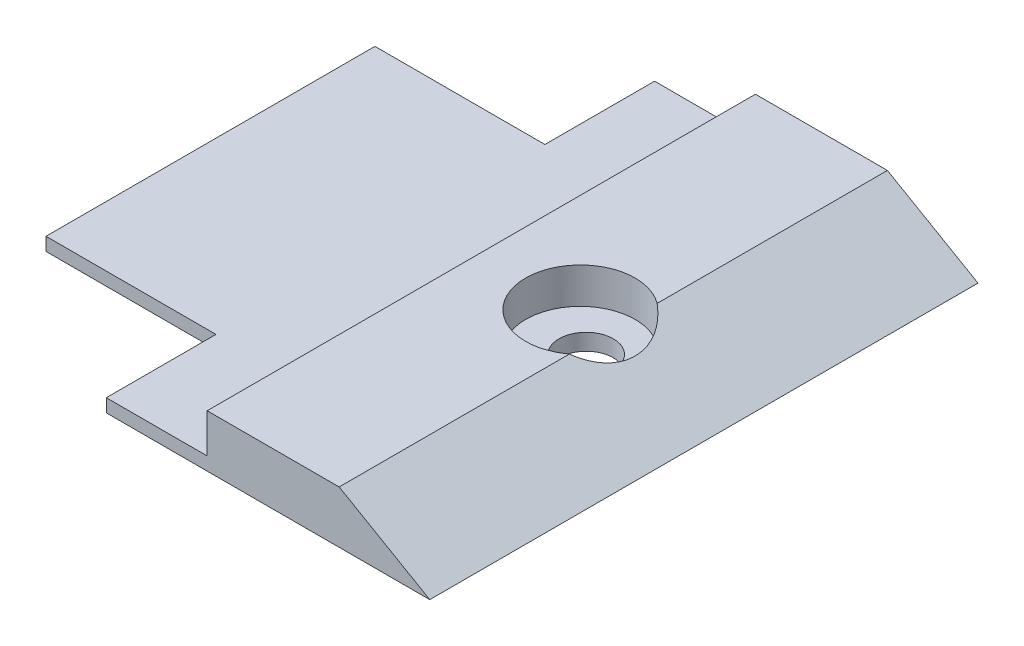
ISO-10303-21;
HEADER;
FILE_DESCRIPTION(('STEP AP214'),'2;1');
FILE_NAME('part.step','',(''),(''),'','','');
FILE_SCHEMA(('AUTOMOTIVE_DESIGN { 1 0 10303 214 1 1 1 1 }'));
ENDSEC;
DATA;
#1=APPLICATION_CONTEXT('core data for automotive mechanical design processes');
#2=APPLICATION_PROTOCOL_DEFINITION('international standard','automotive_design',2000,#1);
#3=PRODUCT_CONTEXT('',#1,'mechanical');
#4=PRODUCT('Part','Part','',(#3));
#5=PRODUCT_RELATED_PRODUCT_CATEGORY('part','',(#4));
#6=PRODUCT_DEFINITION_FORMATION('','',#4);
#7=PRODUCT_DEFINITION_CONTEXT('part definition',#1,'design');
#8=PRODUCT_DEFINITION('design','',#6,#7);
#9=PRODUCT_DEFINITION_SHAPE('','',#8);
#10=(LENGTH_UNIT() NAMED_UNIT(*) SI_UNIT(.MILLI.,.METRE.));
#11=(NAMED_UNIT(*) PLANE_ANGLE_UNIT() SI_UNIT($,.RADIAN.));
#12=(NAMED_UNIT(*) SI_UNIT($,.STERADIAN.) SOLID_ANGLE_UNIT());
#13=UNCERTAINTY_MEASURE_WITH_UNIT(LENGTH_MEASURE(1.E-05),#10,'distance_accuracy_value','');
#14=(GEOMETRIC_REPRESENTATION_CONTEXT(3) GLOBAL_UNCERTAINTY_ASSIGNED_CONTEXT((#13)) GLOBAL_UNIT_ASSIGNED_CONTEXT((#10,
#11,#12)) REPRESENTATION_CONTEXT('',''));
#15=CARTESIAN_POINT('',(0.,0.,0.));
#16=DIRECTION('',(0.,0.,1.));
#17=DIRECTION('',(1.,0.,0.));
#18=AXIS2_PLACEMENT_3D('',#15,#16,#17);
#19=CARTESIAN_POINT('',(34.2632439137434,0.,-15.));
#20=DIRECTION('',(0.,1.,0.));
#21=DIRECTION('',(0.,0.,1.));
#22=AXIS2_PLACEMENT_3D('',#19,#20,#21);
#23=CYLINDRICAL_SURFACE('',#22,2.47487373415291);
#24=CARTESIAN_POINT('',(34.2632439137434,0.,-15.));
#25=DIRECTION('',(0.,1.,0.));
#26=DIRECTION('',(0.,0.,1.));
#27=AXIS2_PLACEMENT_3D('',#24,#25,#26);
#28=CIRCLE('',#27,2.47487373415291);
#29=CARTESIAN_POINT('',(34.2632439137434,0.,-12.5251262658471));
#30=VERTEX_POINT('',#29);
#31=EDGE_CURVE('E236',#30,#30,#28,.T.);
#32=ORIENTED_EDGE('',*,*,#31,.F.);
#33=EDGE_LOOP('',(#32));
#34=FACE_BOUND('',#33,.T.);
#35=CARTESIAN_POINT('',(34.2632439137434,1.5,-15.));
#36=DIRECTION('',(0.,1.,0.));
#37=DIRECTION('',(0.,0.,1.));
#38=AXIS2_PLACEMENT_3D('',#35,#36,#37);
#39=CIRCLE('',#38,2.47487373415291);
#40=CARTESIAN_POINT('',(34.2632439137434,1.5,-12.5251262658471));
#41=VERTEX_POINT('',#40);
#42=EDGE_CURVE('E233',#41,#41,#39,.F.);
#43=ORIENTED_EDGE('',*,*,#42,.F.);
#44=EDGE_LOOP('',(#43));
#45=FACE_BOUND('',#44,.T.);
#46=ADVANCED_FACE('F39',(#34,#45),#23,.F.);
#47=CARTESIAN_POINT('',(0.,4.77,-30.));
#48=DIRECTION('',(1.,0.,0.));
#49=DIRECTION('',(0.,0.,-1.));
#50=AXIS2_PLACEMENT_3D('',#47,#48,#49);
#51=PLANE('',#50);
#52=DIRECTION('',(0.,0.,-1.));
#53=VECTOR('',#52,1.);
#54=CARTESIAN_POINT('',(0.,1.2,10.));
#55=LINE('',#54,#53);
#56=CARTESIAN_POINT('',(0.,1.2,0.));
#57=VERTEX_POINT('',#56);
#58=CARTESIAN_POINT('',(0.,1.2,-30.));
#59=VERTEX_POINT('',#58);
#60=EDGE_CURVE('E164',#57,#59,#55,.T.);
#61=ORIENTED_EDGE('',*,*,#60,.T.);
#62=DIRECTION('',(0.,-1.,0.));
#63=VECTOR('',#62,1.);
#64=CARTESIAN_POINT('',(0.,4.77,-30.));
#65=LINE('',#64,#63);
#66=CARTESIAN_POINT('',(0.,0.,-30.));
#67=VERTEX_POINT('',#66);
#68=EDGE_CURVE('E185',#59,#67,#65,.T.);
#69=ORIENTED_EDGE('',*,*,#68,.T.);
#70=DIRECTION('',(0.,0.,1.));
#71=VECTOR('',#70,1.);
#72=CARTESIAN_POINT('',(0.,0.,-30.));
#73=LINE('',#72,#71);
#74=CARTESIAN_POINT('',(0.,0.,0.));
#75=VERTEX_POINT('',#74);
#76=EDGE_CURVE('E177',#67,#75,#73,.T.);
#77=ORIENTED_EDGE('',*,*,#76,.T.);
#78=DIRECTION('',(0.,-1.,0.));
#79=VECTOR('',#78,1.);
#80=CARTESIAN_POINT('',(0.,4.77,0.));
#81=LINE('',#80,#79);
#82=EDGE_CURVE('E229',#57,#75,#81,.T.);
#83=ORIENTED_EDGE('',*,*,#82,.F.);
#84=EDGE_LOOP('',(#61,#69,#77,#83));
#85=FACE_BOUND('',#84,.T.);
#86=ADVANCED_FACE('F41',(#85),#51,.F.);
#87=CARTESIAN_POINT('',(0.,4.77,0.));
#88=DIRECTION('',(0.,0.,-1.));
#89=DIRECTION('',(-1.,0.,0.));
#90=AXIS2_PLACEMENT_3D('',#87,#88,#89);
#91=PLANE('',#90);
#92=DIRECTION('',(1.,0.,0.));
#93=VECTOR('',#92,1.);
#94=CARTESIAN_POINT('',(0.,1.2,0.));
#95=LINE('',#94,#93);
#96=CARTESIAN_POINT('',(15.5,1.2,0.));
#97=VERTEX_POINT('',#96);
#98=EDGE_CURVE('E174',#57,#97,#95,.T.);
#99=ORIENTED_EDGE('',*,*,#98,.F.);
#100=ORIENTED_EDGE('',*,*,#82,.T.);
#101=DIRECTION('',(1.,0.,0.));
#102=VECTOR('',#101,1.);
#103=CARTESIAN_POINT('',(0.,0.,0.));
#104=LINE('',#103,#102);
#105=CARTESIAN_POINT('',(15.5,0.,0.));
#106=VERTEX_POINT('',#105);
#107=EDGE_CURVE('E189',#75,#106,#104,.T.);
#108=ORIENTED_EDGE('',*,*,#107,.T.);
#109=DIRECTION('',(0.,-1.,0.));
#110=VECTOR('',#109,1.);
#111=CARTESIAN_POINT('',(15.5,4.77,0.));
#112=LINE('',#111,#110);
#113=EDGE_CURVE('E226',#97,#106,#112,.T.);
#114=ORIENTED_EDGE('',*,*,#113,.F.);
#115=EDGE_LOOP('',(#99,#100,#108,#114));
#116=FACE_BOUND('',#115,.T.);
#117=ADVANCED_FACE('F283',(#116),#91,.F.);
#118=CARTESIAN_POINT('',(15.5,4.77,0.));
#119=DIRECTION('',(1.,0.,0.));
#120=DIRECTION('',(0.,0.,-1.));
#121=AXIS2_PLACEMENT_3D('',#118,#119,#120);
#122=PLANE('',#121);
#123=DIRECTION('',(0.,0.,1.));
#124=VECTOR('',#123,1.);
#125=CARTESIAN_POINT('',(15.5,1.2,0.));
#126=LINE('',#125,#124);
#127=CARTESIAN_POINT('',(15.5,1.2,10.));
#128=VERTEX_POINT('',#127);
#129=EDGE_CURVE('E171',#97,#128,#126,.T.);
#130=ORIENTED_EDGE('',*,*,#129,.F.);
#131=ORIENTED_EDGE('',*,*,#113,.T.);
#132=DIRECTION('',(0.,0.,1.));
#133=VECTOR('',#132,1.);
#134=CARTESIAN_POINT('',(15.5,0.,0.));
#135=LINE('',#134,#133);
#136=CARTESIAN_POINT('',(15.5,0.,9.99999999999999));
#137=VERTEX_POINT('',#136);
#138=EDGE_CURVE('E193',#106,#137,#135,.T.);
#139=ORIENTED_EDGE('',*,*,#138,.T.);
#140=DIRECTION('',(0.,-1.,0.));
#141=VECTOR('',#140,1.);
#142=CARTESIAN_POINT('',(15.5,4.77,9.99999999999999));
#143=LINE('',#142,#141);
#144=EDGE_CURVE('E223',#128,#137,#143,.T.);
#145=ORIENTED_EDGE('',*,*,#144,.F.);
#146=EDGE_LOOP('',(#130,#131,#139,#145));
#147=FACE_BOUND('',#146,.T.);
#148=ADVANCED_FACE('F286',(#147),#122,.F.);
#149=CARTESIAN_POINT('',(15.5,4.77,9.99999999999999));
#150=DIRECTION('',(0.,0.,-1.));
#151=DIRECTION('',(-1.,0.,0.));
#152=AXIS2_PLACEMENT_3D('',#149,#150,#151);
#153=PLANE('',#152);
#154=DIRECTION('',(1.,0.,0.));
#155=VECTOR('',#154,1.);
#156=CARTESIAN_POINT('',(15.5,0.,9.99999999999999));
#157=LINE('',#156,#155);
#158=CARTESIAN_POINT('',(45.,0.,10.));
#159=VERTEX_POINT('',#158);
#160=EDGE_CURVE('E197',#137,#159,#157,.T.);
#161=ORIENTED_EDGE('',*,*,#160,.T.);
#162=DIRECTION('',(0.866025403784442,-0.499999999999995,0.));
#163=VECTOR('',#162,1.);
#164=CARTESIAN_POINT('',(45.,0.,9.99999999999999));
#165=LINE('',#164,#163);
#166=CARTESIAN_POINT('',(36.7381176478963,4.77,9.99999999999999));
#167=VERTEX_POINT('',#166);
#168=EDGE_CURVE('E147',#167,#159,#165,.T.);
#169=ORIENTED_EDGE('',*,*,#168,.F.);
#170=DIRECTION('',(1.,0.,0.));
#171=VECTOR('',#170,1.);
#172=CARTESIAN_POINT('',(15.5,4.77,9.99999999999999));
#173=LINE('',#172,#171);
#174=CARTESIAN_POINT('',(24.7,4.77,10.));
#175=VERTEX_POINT('',#174);
#176=EDGE_CURVE('E178',#175,#167,#173,.T.);
#177=ORIENTED_EDGE('',*,*,#176,.F.);
#178=DIRECTION('',(0.,1.,0.));
#179=VECTOR('',#178,1.);
#180=CARTESIAN_POINT('',(24.7,4.77,10.));
#181=LINE('',#180,#179);
#182=CARTESIAN_POINT('',(24.7,1.2,10.));
#183=VERTEX_POINT('',#182);
#184=EDGE_CURVE('E61',#183,#175,#181,.T.);
#185=ORIENTED_EDGE('',*,*,#184,.F.);
#186=DIRECTION('',(1.,0.,0.));
#187=VECTOR('',#186,1.);
#188=CARTESIAN_POINT('',(0.,1.2,10.));
#189=LINE('',#188,#187);
#190=EDGE_CURVE('E153',#128,#183,#189,.T.);
#191=ORIENTED_EDGE('',*,*,#190,.F.);
#192=ORIENTED_EDGE('',*,*,#144,.T.);
#193=EDGE_LOOP('',(#161,#169,#177,#185,#191,#192));
#194=FACE_BOUND('',#193,.T.);
#195=ADVANCED_FACE('F256',(#194),#153,.F.);
#196=CARTESIAN_POINT('',(45.,4.77,-40.));
#197=DIRECTION('',(0.,0.,1.));
#198=DIRECTION('',(1.,0.,0.));
#199=AXIS2_PLACEMENT_3D('',#196,#197,#198);
#200=PLANE('',#199);
#201=DIRECTION('',(-1.,0.,0.));
#202=VECTOR('',#201,1.);
#203=CARTESIAN_POINT('',(45.,4.77,-40.));
#204=LINE('',#203,#202);
#205=CARTESIAN_POINT('',(36.7381176478963,4.77,-40.));
#206=VERTEX_POINT('',#205);
#207=CARTESIAN_POINT('',(24.7,4.77,-40.));
#208=VERTEX_POINT('',#207);
#209=EDGE_CURVE('E181',#206,#208,#204,.T.);
#210=ORIENTED_EDGE('',*,*,#209,.F.);
#211=DIRECTION('',(0.866025403784442,-0.499999999999995,0.));
#212=VECTOR('',#211,1.);
#213=CARTESIAN_POINT('',(45.,0.,-40.));
#214=LINE('',#213,#212);
#215=CARTESIAN_POINT('',(45.,0.,-40.));
#216=VERTEX_POINT('',#215);
#217=EDGE_CURVE('E137',#206,#216,#214,.T.);
#218=ORIENTED_EDGE('',*,*,#217,.T.);
#219=DIRECTION('',(-1.,0.,0.));
#220=VECTOR('',#219,1.);
#221=CARTESIAN_POINT('',(45.,0.,-40.));
#222=LINE('',#221,#220);
#223=CARTESIAN_POINT('',(15.5,0.,-40.));
#224=VERTEX_POINT('',#223);
#225=EDGE_CURVE('E204',#216,#224,#222,.T.);
#226=ORIENTED_EDGE('',*,*,#225,.T.);
#227=DIRECTION('',(0.,-1.,0.));
#228=VECTOR('',#227,1.);
#229=CARTESIAN_POINT('',(15.5,4.77,-40.));
#230=LINE('',#229,#228);
#231=CARTESIAN_POINT('',(15.5,1.2,-40.));
#232=VERTEX_POINT('',#231);
#233=EDGE_CURVE('E220',#232,#224,#230,.T.);
#234=ORIENTED_EDGE('',*,*,#233,.F.);
#235=DIRECTION('',(1.,0.,0.));
#236=VECTOR('',#235,1.);
#237=CARTESIAN_POINT('',(0.,1.2,-40.));
#238=LINE('',#237,#236);
#239=CARTESIAN_POINT('',(24.7,1.2,-40.));
#240=VERTEX_POINT('',#239);
#241=EDGE_CURVE('E139',#232,#240,#238,.T.);
#242=ORIENTED_EDGE('',*,*,#241,.T.);
#243=DIRECTION('',(0.,1.,0.));
#244=VECTOR('',#243,1.);
#245=CARTESIAN_POINT('',(24.7,4.77,-40.));
#246=LINE('',#245,#244);
#247=EDGE_CURVE('E144',#240,#208,#246,.T.);
#248=ORIENTED_EDGE('',*,*,#247,.T.);
#249=EDGE_LOOP('',(#210,#218,#226,#234,#242,#248));
#250=FACE_BOUND('',#249,.T.);
#251=ADVANCED_FACE('F266',(#250),#200,.F.);
#252=CARTESIAN_POINT('',(15.5,4.77,-40.));
#253=DIRECTION('',(1.,0.,0.));
#254=DIRECTION('',(0.,0.,-1.));
#255=AXIS2_PLACEMENT_3D('',#252,#253,#254);
#256=PLANE('',#255);
#257=DIRECTION('',(0.,0.,1.));
#258=VECTOR('',#257,1.);
#259=CARTESIAN_POINT('',(15.5,1.2,-40.));
#260=LINE('',#259,#258);
#261=CARTESIAN_POINT('',(15.5,1.2,-30.));
#262=VERTEX_POINT('',#261);
#263=EDGE_CURVE('E168',#232,#262,#260,.T.);
#264=ORIENTED_EDGE('',*,*,#263,.F.);
#265=ORIENTED_EDGE('',*,*,#233,.T.);
#266=DIRECTION('',(0.,0.,1.));
#267=VECTOR('',#266,1.);
#268=CARTESIAN_POINT('',(15.5,0.,-40.));
#269=LINE('',#268,#267);
#270=CARTESIAN_POINT('',(15.5,0.,-30.));
#271=VERTEX_POINT('',#270);
#272=EDGE_CURVE('E208',#224,#271,#269,.T.);
#273=ORIENTED_EDGE('',*,*,#272,.T.);
#274=DIRECTION('',(0.,-1.,0.));
#275=VECTOR('',#274,1.);
#276=CARTESIAN_POINT('',(15.5,4.77,-30.));
#277=LINE('',#276,#275);
#278=EDGE_CURVE('E217',#262,#271,#277,.T.);
#279=ORIENTED_EDGE('',*,*,#278,.F.);
#280=EDGE_LOOP('',(#264,#265,#273,#279));
#281=FACE_BOUND('',#280,.T.);
#282=ADVANCED_FACE('F269',(#281),#256,.F.);
#283=CARTESIAN_POINT('',(15.5,4.77,-30.));
#284=DIRECTION('',(0.,0.,1.));
#285=DIRECTION('',(1.,0.,0.));
#286=AXIS2_PLACEMENT_3D('',#283,#284,#285);
#287=PLANE('',#286);
#288=DIRECTION('',(-1.,0.,0.));
#289=VECTOR('',#288,1.);
#290=CARTESIAN_POINT('',(15.5,1.2,-30.));
#291=LINE('',#290,#289);
#292=EDGE_CURVE('E48',#262,#59,#291,.T.);
#293=ORIENTED_EDGE('',*,*,#292,.F.);
#294=ORIENTED_EDGE('',*,*,#278,.T.);
#295=DIRECTION('',(-1.,0.,0.));
#296=VECTOR('',#295,1.);
#297=CARTESIAN_POINT('',(15.5,0.,-30.));
#298=LINE('',#297,#296);
#299=EDGE_CURVE('E182',#271,#67,#298,.T.);
#300=ORIENTED_EDGE('',*,*,#299,.T.);
#301=ORIENTED_EDGE('',*,*,#68,.F.);
#302=EDGE_LOOP('',(#293,#294,#300,#301));
#303=FACE_BOUND('',#302,.T.);
#304=ADVANCED_FACE('F276',(#303),#287,.F.);
#305=CARTESIAN_POINT('',(0.,4.77,0.));
#306=DIRECTION('',(0.,1.,0.));
#307=DIRECTION('',(0.,0.,1.));
#308=AXIS2_PLACEMENT_3D('',#305,#306,#307);
#309=PLANE('',#308);
#310=CARTESIAN_POINT('',(33.7381176478963,4.77,-15.));
#311=DIRECTION('',(0.,1.,0.));
#312=DIRECTION('',(0.,0.,1.));
#313=AXIS2_PLACEMENT_3D('',#310,#311,#312);
#314=CIRCLE('',#313,5.);
#315=CARTESIAN_POINT('',(36.7381176478963,4.77,-19.));
#316=VERTEX_POINT('',#315);
#317=CARTESIAN_POINT('',(36.7381176478963,4.77,-11.));
#318=VERTEX_POINT('',#317);
#319=EDGE_CURVE('E54',#316,#318,#314,.T.);
#320=ORIENTED_EDGE('',*,*,#319,.F.);
#321=DIRECTION('',(0.,0.,1.));
#322=VECTOR('',#321,1.);
#323=CARTESIAN_POINT('',(36.7381176478963,4.77,-40.));
#324=LINE('',#323,#322);
#325=EDGE_CURVE('E128',#206,#316,#324,.T.);
#326=ORIENTED_EDGE('',*,*,#325,.F.);
#327=ORIENTED_EDGE('',*,*,#209,.T.);
#328=DIRECTION('',(0.,0.,-1.));
#329=VECTOR('',#328,1.);
#330=CARTESIAN_POINT('',(24.7,4.77,10.));
#331=LINE('',#330,#329);
#332=EDGE_CURVE('E158',#175,#208,#331,.T.);
#333=ORIENTED_EDGE('',*,*,#332,.F.);
#334=ORIENTED_EDGE('',*,*,#176,.T.);
#335=EDGE_CURVE('E131',#318,#167,#324,.T.);
#336=ORIENTED_EDGE('',*,*,#335,.F.);
#337=EDGE_LOOP('',(#320,#326,#327,#333,#334,#336));
#338=FACE_BOUND('',#337,.T.);
#339=ADVANCED_FACE('F127',(#338),#309,.T.);
#340=CARTESIAN_POINT('',(0.,0.,0.));
#341=DIRECTION('',(0.,1.,0.));
#342=DIRECTION('',(0.,0.,1.));
#343=AXIS2_PLACEMENT_3D('',#340,#341,#342);
#344=PLANE('',#343);
#345=ORIENTED_EDGE('',*,*,#31,.T.);
#346=EDGE_LOOP('',(#345));
#347=FACE_BOUND('',#346,.T.);
#348=ORIENTED_EDGE('',*,*,#76,.F.);
#349=ORIENTED_EDGE('',*,*,#299,.F.);
#350=ORIENTED_EDGE('',*,*,#272,.F.);
#351=ORIENTED_EDGE('',*,*,#225,.F.);
#352=DIRECTION('',(0.,0.,-1.));
#353=VECTOR('',#352,1.);
#354=CARTESIAN_POINT('',(45.,0.,10.));
#355=LINE('',#354,#353);
#356=EDGE_CURVE('E201',#159,#216,#355,.T.);
#357=ORIENTED_EDGE('',*,*,#356,.F.);
#358=ORIENTED_EDGE('',*,*,#160,.F.);
#359=ORIENTED_EDGE('',*,*,#138,.F.);
#360=ORIENTED_EDGE('',*,*,#107,.F.);
#361=EDGE_LOOP('',(#348,#349,#350,#351,#357,#358,#359,#360));
#362=FACE_BOUND('',#361,.T.);
#363=ADVANCED_FACE('F262',(#347,#362),#344,.F.);
#364=CARTESIAN_POINT('',(0.,1.2,10.));
#365=DIRECTION('',(0.,1.,0.));
#366=DIRECTION('',(0.,0.,1.));
#367=AXIS2_PLACEMENT_3D('',#364,#365,#366);
#368=PLANE('',#367);
#369=ORIENTED_EDGE('',*,*,#98,.T.);
#370=ORIENTED_EDGE('',*,*,#129,.T.);
#371=ORIENTED_EDGE('',*,*,#190,.T.);
#372=DIRECTION('',(0.,0.,-1.));
#373=VECTOR('',#372,1.);
#374=CARTESIAN_POINT('',(24.7,1.2,10.));
#375=LINE('',#374,#373);
#376=EDGE_CURVE('E161',#183,#240,#375,.T.);
#377=ORIENTED_EDGE('',*,*,#376,.T.);
#378=ORIENTED_EDGE('',*,*,#241,.F.);
#379=ORIENTED_EDGE('',*,*,#263,.T.);
#380=ORIENTED_EDGE('',*,*,#292,.T.);
#381=ORIENTED_EDGE('',*,*,#60,.F.);
#382=EDGE_LOOP('',(#369,#370,#371,#377,#378,#379,#380,#381));
#383=FACE_BOUND('',#382,.T.);
#384=ADVANCED_FACE('F273',(#383),#368,.T.);
#385=CARTESIAN_POINT('',(24.7,4.77,10.));
#386=DIRECTION('',(-1.,0.,0.));
#387=DIRECTION('',(0.,0.,1.));
#388=AXIS2_PLACEMENT_3D('',#385,#386,#387);
#389=PLANE('',#388);
#390=ORIENTED_EDGE('',*,*,#376,.F.);
#391=ORIENTED_EDGE('',*,*,#184,.T.);
#392=ORIENTED_EDGE('',*,*,#332,.T.);
#393=ORIENTED_EDGE('',*,*,#247,.F.);
#394=EDGE_LOOP('',(#390,#391,#392,#393));
#395=FACE_BOUND('',#394,.T.);
#396=ADVANCED_FACE('F288',(#395),#389,.T.);
#397=CARTESIAN_POINT('',(45.,0.,-40.));
#398=DIRECTION('',(-0.499999999999995,-0.866025403784442,0.));
#399=DIRECTION('',(0.866025403784442,-0.499999999999995,0.));
#400=AXIS2_PLACEMENT_3D('',#397,#398,#399);
#401=PLANE('',#400);
#402=ORIENTED_EDGE('',*,*,#325,.T.);
#403=CARTESIAN_POINT('',(33.7381176478963,6.50205080756885,-15.));
#404=DIRECTION('',(-0.499999999999995,-0.866025403784442,0.));
#405=DIRECTION('',(-0.866025403784442,0.499999999999995,0.));
#406=AXIS2_PLACEMENT_3D('',#403,#404,#405);
#407=ELLIPSE('',#406,5.77350269189623,5.);
#408=EDGE_CURVE('E11',#316,#318,#407,.T.);
#409=ORIENTED_EDGE('',*,*,#408,.T.);
#410=ORIENTED_EDGE('',*,*,#335,.T.);
#411=ORIENTED_EDGE('',*,*,#168,.T.);
#412=ORIENTED_EDGE('',*,*,#356,.T.);
#413=ORIENTED_EDGE('',*,*,#217,.F.);
#414=EDGE_LOOP('',(#402,#409,#410,#411,#412,#413));
#415=FACE_BOUND('',#414,.T.);
#416=ADVANCED_FACE('F135',(#415),#401,.F.);
#417=CARTESIAN_POINT('',(33.7381176478963,1.5,-15.));
#418=DIRECTION('',(0.,1.,0.));
#419=DIRECTION('',(0.,0.,1.));
#420=AXIS2_PLACEMENT_3D('',#417,#418,#419);
#421=CYLINDRICAL_SURFACE('',#420,5.);
#422=CARTESIAN_POINT('',(33.7381176478963,1.5,-15.));
#423=DIRECTION('',(0.,1.,0.));
#424=DIRECTION('',(0.,0.,1.));
#425=AXIS2_PLACEMENT_3D('',#422,#423,#424);
#426=CIRCLE('',#425,5.);
#427=CARTESIAN_POINT('',(33.7381176478963,1.5,-9.99999999999999));
#428=VERTEX_POINT('',#427);
#429=EDGE_CURVE('E133',#428,#428,#426,.T.);
#430=ORIENTED_EDGE('',*,*,#429,.F.);
#431=EDGE_LOOP('',(#430));
#432=FACE_BOUND('',#431,.T.);
#433=ORIENTED_EDGE('',*,*,#319,.T.);
#434=ORIENTED_EDGE('',*,*,#408,.F.);
#435=EDGE_LOOP('',(#433,#434));
#436=FACE_BOUND('',#435,.T.);
#437=ADVANCED_FACE('F121',(#432,#436),#421,.F.);
#438=CARTESIAN_POINT('',(33.7381176478963,1.5,-15.));
#439=DIRECTION('',(0.,1.,0.));
#440=DIRECTION('',(0.,0.,1.));
#441=AXIS2_PLACEMENT_3D('',#438,#439,#440);
#442=PLANE('',#441);
#443=ORIENTED_EDGE('',*,*,#429,.T.);
#444=EDGE_LOOP('',(#443));
#445=FACE_BOUND('',#444,.T.);
#446=ORIENTED_EDGE('',*,*,#42,.T.);
#447=EDGE_LOOP('',(#446));
#448=FACE_BOUND('',#447,.T.);
#449=ADVANCED_FACE('F308',(#445,#448),#442,.T.);
#450=CLOSED_SHELL('',(#46,#86,#117,#148,#195,#251,#282,#304,#339,#363,#384,#396,#416,#437,#449));
#451=MANIFOLD_SOLID_BREP('B2',#450);
#452=ADVANCED_BREP_SHAPE_REPRESENTATION('',(#18,#451),#14);
#453=SHAPE_DEFINITION_REPRESENTATION(#9,#452);
ENDSEC;
END-ISO-10303-21;
